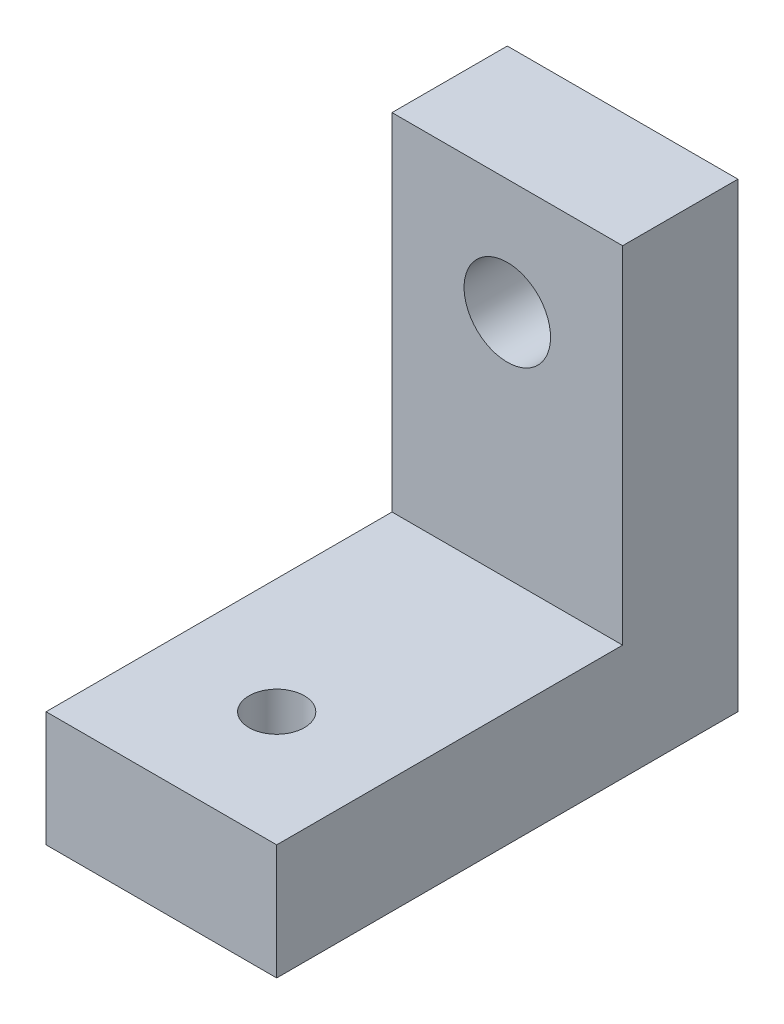
ISO-10303-21;
HEADER;
FILE_DESCRIPTION(('STEP AP214'),'2;1');
FILE_NAME('part.step','',(''),(''),'','','');
FILE_SCHEMA(('AUTOMOTIVE_DESIGN { 1 0 10303 214 1 1 1 1 }'));
ENDSEC;
DATA;
#1=APPLICATION_CONTEXT('core data for automotive mechanical design processes');
#2=APPLICATION_PROTOCOL_DEFINITION('international standard','automotive_design',2000,#1);
#3=PRODUCT_CONTEXT('',#1,'mechanical');
#4=PRODUCT('Part','Part','',(#3));
#5=PRODUCT_RELATED_PRODUCT_CATEGORY('part','',(#4));
#6=PRODUCT_DEFINITION_FORMATION('','',#4);
#7=PRODUCT_DEFINITION_CONTEXT('part definition',#1,'design');
#8=PRODUCT_DEFINITION('design','',#6,#7);
#9=PRODUCT_DEFINITION_SHAPE('','',#8);
#10=(LENGTH_UNIT() NAMED_UNIT(*) SI_UNIT(.MILLI.,.METRE.));
#11=(NAMED_UNIT(*) PLANE_ANGLE_UNIT() SI_UNIT($,.RADIAN.));
#12=(NAMED_UNIT(*) SI_UNIT($,.STERADIAN.) SOLID_ANGLE_UNIT());
#13=UNCERTAINTY_MEASURE_WITH_UNIT(LENGTH_MEASURE(1.E-05),#10,'distance_accuracy_value','');
#14=(GEOMETRIC_REPRESENTATION_CONTEXT(3) GLOBAL_UNCERTAINTY_ASSIGNED_CONTEXT((#13)) GLOBAL_UNIT_ASSIGNED_CONTEXT((#10,
#11,#12)) REPRESENTATION_CONTEXT('',''));
#15=CARTESIAN_POINT('',(0.,0.,0.));
#16=DIRECTION('',(0.,0.,1.));
#17=DIRECTION('',(1.,0.,0.));
#18=AXIS2_PLACEMENT_3D('',#15,#16,#17);
#19=CARTESIAN_POINT('',(0.,0.,6.35));
#20=DIRECTION('',(0.,0.,-1.));
#21=DIRECTION('',(-1.,0.,0.));
#22=AXIS2_PLACEMENT_3D('',#19,#20,#21);
#23=PLANE('',#22);
#24=CARTESIAN_POINT('',(0.,0.,6.35));
#25=DIRECTION('',(0.,0.,1.));
#26=DIRECTION('',(1.,0.,0.));
#27=AXIS2_PLACEMENT_3D('',#24,#25,#26);
#28=CIRCLE('',#27,2.38125);
#29=CARTESIAN_POINT('',(2.38125,0.,6.35));
#30=VERTEX_POINT('',#29);
#31=EDGE_CURVE('E127',#30,#30,#28,.T.);
#32=ORIENTED_EDGE('',*,*,#31,.F.);
#33=EDGE_LOOP('',(#32));
#34=FACE_BOUND('',#33,.T.);
#35=DIRECTION('',(-1.,0.,0.));
#36=VECTOR('',#35,1.);
#37=CARTESIAN_POINT('',(-6.35,-12.7,6.35));
#38=LINE('',#37,#36);
#39=CARTESIAN_POINT('',(6.35,-12.7,6.35));
#40=VERTEX_POINT('',#39);
#41=CARTESIAN_POINT('',(-6.35,-12.7,6.35));
#42=VERTEX_POINT('',#41);
#43=EDGE_CURVE('E55',#40,#42,#38,.T.);
#44=ORIENTED_EDGE('',*,*,#43,.F.);
#45=DIRECTION('',(0.,1.,0.));
#46=VECTOR('',#45,1.);
#47=CARTESIAN_POINT('',(6.35,0.,6.35));
#48=LINE('',#47,#46);
#49=CARTESIAN_POINT('',(6.35,6.35,6.35));
#50=VERTEX_POINT('',#49);
#51=EDGE_CURVE('E112',#40,#50,#48,.T.);
#52=ORIENTED_EDGE('',*,*,#51,.T.);
#53=DIRECTION('',(-1.,0.,0.));
#54=VECTOR('',#53,1.);
#55=CARTESIAN_POINT('',(-6.35,6.35,6.35));
#56=LINE('',#55,#54);
#57=CARTESIAN_POINT('',(-6.35,6.35,6.35));
#58=VERTEX_POINT('',#57);
#59=EDGE_CURVE('E61',#50,#58,#56,.T.);
#60=ORIENTED_EDGE('',*,*,#59,.T.);
#61=DIRECTION('',(0.,-1.,0.));
#62=VECTOR('',#61,1.);
#63=CARTESIAN_POINT('',(-6.35,0.,6.35));
#64=LINE('',#63,#62);
#65=EDGE_CURVE('E105',#58,#42,#64,.T.);
#66=ORIENTED_EDGE('',*,*,#65,.T.);
#67=EDGE_LOOP('',(#44,#52,#60,#66));
#68=FACE_BOUND('',#67,.T.);
#69=ADVANCED_FACE('F39',(#34,#68),#23,.F.);
#70=CARTESIAN_POINT('',(0.,0.,0.));
#71=DIRECTION('',(0.,0.,-1.));
#72=DIRECTION('',(-1.,0.,0.));
#73=AXIS2_PLACEMENT_3D('',#70,#71,#72);
#74=PLANE('',#73);
#75=DIRECTION('',(-1.,0.,0.));
#76=VECTOR('',#75,1.);
#77=CARTESIAN_POINT('',(-6.35,6.35,0.));
#78=LINE('',#77,#76);
#79=CARTESIAN_POINT('',(6.35,6.35,0.));
#80=VERTEX_POINT('',#79);
#81=CARTESIAN_POINT('',(-6.35,6.35,0.));
#82=VERTEX_POINT('',#81);
#83=EDGE_CURVE('E110',#80,#82,#78,.T.);
#84=ORIENTED_EDGE('',*,*,#83,.F.);
#85=DIRECTION('',(0.,1.,0.));
#86=VECTOR('',#85,1.);
#87=CARTESIAN_POINT('',(6.35,-19.05,0.));
#88=LINE('',#87,#86);
#89=CARTESIAN_POINT('',(6.35,-19.05,0.));
#90=VERTEX_POINT('',#89);
#91=EDGE_CURVE('E93',#90,#80,#88,.T.);
#92=ORIENTED_EDGE('',*,*,#91,.F.);
#93=DIRECTION('',(1.,0.,0.));
#94=VECTOR('',#93,1.);
#95=CARTESIAN_POINT('',(-6.35,-19.05,0.));
#96=LINE('',#95,#94);
#97=CARTESIAN_POINT('',(-6.35,-19.05,0.));
#98=VERTEX_POINT('',#97);
#99=EDGE_CURVE('E81',#98,#90,#96,.T.);
#100=ORIENTED_EDGE('',*,*,#99,.F.);
#101=DIRECTION('',(0.,-1.,0.));
#102=VECTOR('',#101,1.);
#103=CARTESIAN_POINT('',(-6.35,0.,0.));
#104=LINE('',#103,#102);
#105=EDGE_CURVE('E94',#82,#98,#104,.T.);
#106=ORIENTED_EDGE('',*,*,#105,.F.);
#107=EDGE_LOOP('',(#84,#92,#100,#106));
#108=FACE_BOUND('',#107,.T.);
#109=CARTESIAN_POINT('',(0.,0.,0.));
#110=DIRECTION('',(0.,0.,1.));
#111=DIRECTION('',(1.,0.,0.));
#112=AXIS2_PLACEMENT_3D('',#109,#110,#111);
#113=CIRCLE('',#112,2.38125);
#114=CARTESIAN_POINT('',(2.38125,0.,0.));
#115=VERTEX_POINT('',#114);
#116=EDGE_CURVE('E132',#115,#115,#113,.T.);
#117=ORIENTED_EDGE('',*,*,#116,.T.);
#118=EDGE_LOOP('',(#117));
#119=FACE_BOUND('',#118,.T.);
#120=ADVANCED_FACE('F107',(#108,#119),#74,.T.);
#121=CARTESIAN_POINT('',(-6.35,6.35,6.35));
#122=DIRECTION('',(0.,-1.,0.));
#123=DIRECTION('',(0.,0.,-1.));
#124=AXIS2_PLACEMENT_3D('',#121,#122,#123);
#125=PLANE('',#124);
#126=ORIENTED_EDGE('',*,*,#83,.T.);
#127=DIRECTION('',(0.,0.,-1.));
#128=VECTOR('',#127,1.);
#129=CARTESIAN_POINT('',(-6.35,6.35,6.35));
#130=LINE('',#129,#128);
#131=EDGE_CURVE('E48',#58,#82,#130,.T.);
#132=ORIENTED_EDGE('',*,*,#131,.F.);
#133=ORIENTED_EDGE('',*,*,#59,.F.);
#134=DIRECTION('',(0.,0.,-1.));
#135=VECTOR('',#134,1.);
#136=CARTESIAN_POINT('',(6.35,6.35,6.35));
#137=LINE('',#136,#135);
#138=EDGE_CURVE('E11',#50,#80,#137,.T.);
#139=ORIENTED_EDGE('',*,*,#138,.T.);
#140=EDGE_LOOP('',(#126,#132,#133,#139));
#141=FACE_BOUND('',#140,.T.);
#142=ADVANCED_FACE('F41',(#141),#125,.F.);
#143=CARTESIAN_POINT('',(-6.35,0.,6.35));
#144=DIRECTION('',(1.,0.,0.));
#145=DIRECTION('',(0.,1.,0.));
#146=AXIS2_PLACEMENT_3D('',#143,#144,#145);
#147=PLANE('',#146);
#148=ORIENTED_EDGE('',*,*,#105,.T.);
#149=DIRECTION('',(0.,0.,-1.));
#150=VECTOR('',#149,1.);
#151=CARTESIAN_POINT('',(-6.35,-19.05,6.35));
#152=LINE('',#151,#150);
#153=CARTESIAN_POINT('',(-6.35,-19.05,25.4));
#154=VERTEX_POINT('',#153);
#155=EDGE_CURVE('E89',#154,#98,#152,.T.);
#156=ORIENTED_EDGE('',*,*,#155,.F.);
#157=DIRECTION('',(0.,-1.,0.));
#158=VECTOR('',#157,1.);
#159=CARTESIAN_POINT('',(-6.35,-19.05,25.4));
#160=LINE('',#159,#158);
#161=CARTESIAN_POINT('',(-6.35,-12.7,25.4));
#162=VERTEX_POINT('',#161);
#163=EDGE_CURVE('E152',#162,#154,#160,.T.);
#164=ORIENTED_EDGE('',*,*,#163,.F.);
#165=DIRECTION('',(0.,0.,-1.));
#166=VECTOR('',#165,1.);
#167=CARTESIAN_POINT('',(-6.35,-12.7,25.4));
#168=LINE('',#167,#166);
#169=EDGE_CURVE('E146',#162,#42,#168,.T.);
#170=ORIENTED_EDGE('',*,*,#169,.T.);
#171=ORIENTED_EDGE('',*,*,#65,.F.);
#172=ORIENTED_EDGE('',*,*,#131,.T.);
#173=EDGE_LOOP('',(#148,#156,#164,#170,#171,#172));
#174=FACE_BOUND('',#173,.T.);
#175=ADVANCED_FACE('F123',(#174),#147,.F.);
#176=CARTESIAN_POINT('',(-6.35,-19.05,6.35));
#177=DIRECTION('',(0.,1.,0.));
#178=DIRECTION('',(0.,0.,1.));
#179=AXIS2_PLACEMENT_3D('',#176,#177,#178);
#180=PLANE('',#179);
#181=CARTESIAN_POINT('',(0.,-19.05,19.05));
#182=DIRECTION('',(0.,1.,0.));
#183=DIRECTION('',(0.,0.,1.));
#184=AXIS2_PLACEMENT_3D('',#181,#182,#183);
#185=CIRCLE('',#184,1.524);
#186=CARTESIAN_POINT('',(0.,-19.05,20.574));
#187=VERTEX_POINT('',#186);
#188=EDGE_CURVE('E153',#187,#187,#185,.T.);
#189=ORIENTED_EDGE('',*,*,#188,.T.);
#190=EDGE_LOOP('',(#189));
#191=FACE_BOUND('',#190,.T.);
#192=ORIENTED_EDGE('',*,*,#99,.T.);
#193=DIRECTION('',(0.,0.,-1.));
#194=VECTOR('',#193,1.);
#195=CARTESIAN_POINT('',(6.35,-19.05,6.35));
#196=LINE('',#195,#194);
#197=CARTESIAN_POINT('',(6.35,-19.05,25.4));
#198=VERTEX_POINT('',#197);
#199=EDGE_CURVE('E86',#198,#90,#196,.T.);
#200=ORIENTED_EDGE('',*,*,#199,.F.);
#201=DIRECTION('',(1.,0.,0.));
#202=VECTOR('',#201,1.);
#203=CARTESIAN_POINT('',(-6.35,-19.05,25.4));
#204=LINE('',#203,#202);
#205=EDGE_CURVE('E159',#154,#198,#204,.T.);
#206=ORIENTED_EDGE('',*,*,#205,.F.);
#207=ORIENTED_EDGE('',*,*,#155,.T.);
#208=EDGE_LOOP('',(#192,#200,#206,#207));
#209=FACE_BOUND('',#208,.T.);
#210=ADVANCED_FACE('F83',(#191,#209),#180,.F.);
#211=CARTESIAN_POINT('',(6.35,-19.05,6.35));
#212=DIRECTION('',(-1.,0.,0.));
#213=DIRECTION('',(0.,-1.,0.));
#214=AXIS2_PLACEMENT_3D('',#211,#212,#213);
#215=PLANE('',#214);
#216=ORIENTED_EDGE('',*,*,#91,.T.);
#217=ORIENTED_EDGE('',*,*,#138,.F.);
#218=ORIENTED_EDGE('',*,*,#51,.F.);
#219=DIRECTION('',(0.,0.,-1.));
#220=VECTOR('',#219,1.);
#221=CARTESIAN_POINT('',(6.35,-12.7,25.4));
#222=LINE('',#221,#220);
#223=CARTESIAN_POINT('',(6.35,-12.7,25.4));
#224=VERTEX_POINT('',#223);
#225=EDGE_CURVE('E141',#224,#40,#222,.T.);
#226=ORIENTED_EDGE('',*,*,#225,.F.);
#227=DIRECTION('',(0.,1.,0.));
#228=VECTOR('',#227,1.);
#229=CARTESIAN_POINT('',(6.35,-19.05,25.4));
#230=LINE('',#229,#228);
#231=EDGE_CURVE('E103',#198,#224,#230,.T.);
#232=ORIENTED_EDGE('',*,*,#231,.F.);
#233=ORIENTED_EDGE('',*,*,#199,.T.);
#234=EDGE_LOOP('',(#216,#217,#218,#226,#232,#233));
#235=FACE_BOUND('',#234,.T.);
#236=ADVANCED_FACE('F98',(#235),#215,.F.);
#237=CARTESIAN_POINT('',(0.,0.,6.35));
#238=DIRECTION('',(0.,0.,-1.));
#239=DIRECTION('',(-1.,0.,0.));
#240=AXIS2_PLACEMENT_3D('',#237,#238,#239);
#241=CYLINDRICAL_SURFACE('',#240,2.38125);
#242=ORIENTED_EDGE('',*,*,#31,.T.);
#243=EDGE_LOOP('',(#242));
#244=FACE_BOUND('',#243,.T.);
#245=ORIENTED_EDGE('',*,*,#116,.F.);
#246=EDGE_LOOP('',(#245));
#247=FACE_BOUND('',#246,.T.);
#248=ADVANCED_FACE('F180',(#244,#247),#241,.F.);
#249=CARTESIAN_POINT('',(-6.35,-12.7,25.4));
#250=DIRECTION('',(0.,-1.,0.));
#251=DIRECTION('',(0.,0.,-1.));
#252=AXIS2_PLACEMENT_3D('',#249,#250,#251);
#253=PLANE('',#252);
#254=CARTESIAN_POINT('',(0.,-12.7,19.05));
#255=DIRECTION('',(0.,1.,0.));
#256=DIRECTION('',(0.,0.,1.));
#257=AXIS2_PLACEMENT_3D('',#254,#255,#256);
#258=CIRCLE('',#257,1.524);
#259=CARTESIAN_POINT('',(0.,-12.7,20.574));
#260=VERTEX_POINT('',#259);
#261=EDGE_CURVE('E168',#260,#260,#258,.T.);
#262=ORIENTED_EDGE('',*,*,#261,.F.);
#263=EDGE_LOOP('',(#262));
#264=FACE_BOUND('',#263,.T.);
#265=ORIENTED_EDGE('',*,*,#43,.T.);
#266=ORIENTED_EDGE('',*,*,#169,.F.);
#267=DIRECTION('',(-1.,0.,0.));
#268=VECTOR('',#267,1.);
#269=CARTESIAN_POINT('',(-6.35,-12.7,25.4));
#270=LINE('',#269,#268);
#271=EDGE_CURVE('E149',#224,#162,#270,.T.);
#272=ORIENTED_EDGE('',*,*,#271,.F.);
#273=ORIENTED_EDGE('',*,*,#225,.T.);
#274=EDGE_LOOP('',(#265,#266,#272,#273));
#275=FACE_BOUND('',#274,.T.);
#276=ADVANCED_FACE('F176',(#264,#275),#253,.F.);
#277=CARTESIAN_POINT('',(0.,0.,25.4));
#278=DIRECTION('',(0.,0.,-1.));
#279=DIRECTION('',(-1.,0.,0.));
#280=AXIS2_PLACEMENT_3D('',#277,#278,#279);
#281=PLANE('',#280);
#282=ORIENTED_EDGE('',*,*,#163,.T.);
#283=ORIENTED_EDGE('',*,*,#205,.T.);
#284=ORIENTED_EDGE('',*,*,#231,.T.);
#285=ORIENTED_EDGE('',*,*,#271,.T.);
#286=EDGE_LOOP('',(#282,#283,#284,#285));
#287=FACE_BOUND('',#286,.T.);
#288=ADVANCED_FACE('F179',(#287),#281,.F.);
#289=CARTESIAN_POINT('',(0.,-31.75,19.05));
#290=DIRECTION('',(0.,1.,0.));
#291=DIRECTION('',(0.,0.,1.));
#292=AXIS2_PLACEMENT_3D('',#289,#290,#291);
#293=CYLINDRICAL_SURFACE('',#292,1.524);
#294=CARTESIAN_POINT('',(0.,-12.7,20.574));
#295=CARTESIAN_POINT('',(0.,-12.7661458333333,20.574));
#296=CARTESIAN_POINT('',(0.,-12.8322916666667,20.574));
#297=CARTESIAN_POINT('',(0.,-12.9645833333333,20.574));
#298=CARTESIAN_POINT('',(0.,-13.0307291666667,20.574));
#299=CARTESIAN_POINT('',(0.,-13.1630208333333,20.574));
#300=CARTESIAN_POINT('',(0.,-13.2291666666667,20.574));
#301=CARTESIAN_POINT('',(0.,-13.3614583333333,20.574));
#302=CARTESIAN_POINT('',(0.,-13.4276041666667,20.574));
#303=CARTESIAN_POINT('',(0.,-13.5598958333333,20.574));
#304=CARTESIAN_POINT('',(0.,-13.6260416666667,20.574));
#305=CARTESIAN_POINT('',(0.,-13.7583333333333,20.574));
#306=CARTESIAN_POINT('',(0.,-13.8244791666667,20.574));
#307=CARTESIAN_POINT('',(0.,-13.9567708333333,20.574));
#308=CARTESIAN_POINT('',(0.,-14.0229166666667,20.574));
#309=CARTESIAN_POINT('',(0.,-14.1552083333333,20.574));
#310=CARTESIAN_POINT('',(0.,-14.2213541666667,20.574));
#311=CARTESIAN_POINT('',(0.,-14.3536458333333,20.574));
#312=CARTESIAN_POINT('',(0.,-14.4197916666667,20.574));
#313=CARTESIAN_POINT('',(0.,-14.5520833333333,20.574));
#314=CARTESIAN_POINT('',(0.,-14.6182291666667,20.574));
#315=CARTESIAN_POINT('',(0.,-14.7505208333333,20.574));
#316=CARTESIAN_POINT('',(0.,-14.8166666666667,20.574));
#317=CARTESIAN_POINT('',(0.,-14.9489583333333,20.574));
#318=CARTESIAN_POINT('',(0.,-15.0151041666667,20.574));
#319=CARTESIAN_POINT('',(0.,-15.1473958333333,20.574));
#320=CARTESIAN_POINT('',(0.,-15.2135416666667,20.574));
#321=CARTESIAN_POINT('',(0.,-15.3458333333333,20.574));
#322=CARTESIAN_POINT('',(0.,-15.4119791666667,20.574));
#323=CARTESIAN_POINT('',(0.,-15.5442708333333,20.574));
#324=CARTESIAN_POINT('',(0.,-15.6104166666667,20.574));
#325=CARTESIAN_POINT('',(0.,-15.7427083333333,20.574));
#326=CARTESIAN_POINT('',(0.,-15.8088541666667,20.574));
#327=CARTESIAN_POINT('',(0.,-15.9411458333333,20.574));
#328=CARTESIAN_POINT('',(0.,-16.0072916666667,20.574));
#329=CARTESIAN_POINT('',(0.,-16.1395833333333,20.574));
#330=CARTESIAN_POINT('',(0.,-16.2057291666667,20.574));
#331=CARTESIAN_POINT('',(0.,-16.3380208333333,20.574));
#332=CARTESIAN_POINT('',(0.,-16.4041666666667,20.574));
#333=CARTESIAN_POINT('',(0.,-16.5364583333333,20.574));
#334=CARTESIAN_POINT('',(0.,-16.6026041666667,20.574));
#335=CARTESIAN_POINT('',(0.,-16.7348958333333,20.574));
#336=CARTESIAN_POINT('',(0.,-16.8010416666667,20.574));
#337=CARTESIAN_POINT('',(0.,-16.9333333333333,20.574));
#338=CARTESIAN_POINT('',(0.,-16.9994791666667,20.574));
#339=CARTESIAN_POINT('',(0.,-17.1317708333333,20.574));
#340=CARTESIAN_POINT('',(0.,-17.1979166666667,20.574));
#341=CARTESIAN_POINT('',(0.,-17.3302083333333,20.574));
#342=CARTESIAN_POINT('',(0.,-17.3963541666667,20.574));
#343=CARTESIAN_POINT('',(0.,-17.5286458333333,20.574));
#344=CARTESIAN_POINT('',(0.,-17.5947916666667,20.574));
#345=CARTESIAN_POINT('',(0.,-17.7270833333333,20.574));
#346=CARTESIAN_POINT('',(0.,-17.7932291666667,20.574));
#347=CARTESIAN_POINT('',(0.,-17.9255208333333,20.574));
#348=CARTESIAN_POINT('',(0.,-17.9916666666667,20.574));
#349=CARTESIAN_POINT('',(0.,-18.1239583333333,20.574));
#350=CARTESIAN_POINT('',(0.,-18.1901041666667,20.574));
#351=CARTESIAN_POINT('',(0.,-18.3223958333333,20.574));
#352=CARTESIAN_POINT('',(0.,-18.3885416666667,20.574));
#353=CARTESIAN_POINT('',(0.,-18.5208333333333,20.574));
#354=CARTESIAN_POINT('',(0.,-18.5869791666667,20.574));
#355=CARTESIAN_POINT('',(0.,-18.7192708333333,20.574));
#356=CARTESIAN_POINT('',(0.,-18.7854166666667,20.574));
#357=CARTESIAN_POINT('',(0.,-18.9177083333333,20.574));
#358=CARTESIAN_POINT('',(0.,-18.9838541666667,20.574));
#359=CARTESIAN_POINT('',(0.,-19.05,20.574));
#360=B_SPLINE_CURVE_WITH_KNOTS('',3,(#294,#295,#296,#297,#298,#299,#300,#301,#302,#303,#304,
#305,#306,#307,#308,#309,#310,#311,#312,#313,#314,#315,#316,#317,#318,#319,#320,#321,#322,#323,
#324,#325,#326,#327,#328,#329,#330,#331,#332,#333,#334,#335,#336,#337,#338,#339,#340,#341,#342,
#343,#344,#345,#346,#347,#348,#349,#350,#351,#352,#353,#354,#355,#356,#357,#358,#359),
.UNSPECIFIED.,.F.,.F.,(4,2,2,2,2,2,2,2,2,2,2,2,2,2,2,2,2,2,2,2,2,2,2,2,2,2,2,2,2,2,2,2,4),(0.,
0.198437499999999,0.396875000000001,0.5953125,0.793749999999999,0.992187500000002,1.190625,
1.3890625,1.5875,1.7859375,1.984375,2.1828125,2.38125,2.5796875,2.778125,2.9765625,3.175,
3.3734375,3.571875,3.7703125,3.96875,4.1671875,4.365625,4.5640625,4.7625,4.9609375,5.159375,
5.3578125,5.55625,5.7546875,5.953125,6.1515625,6.35),.UNSPECIFIED.);
#361=EDGE_CURVE('BSEAM173',#260,#187,#360,.T.);
#362=ORIENTED_EDGE('',*,*,#261,.T.);
#363=ORIENTED_EDGE('',*,*,#188,.F.);
#364=ORIENTED_EDGE('',*,*,#361,.T.);
#365=ORIENTED_EDGE('',*,*,#361,.F.);
#366=EDGE_LOOP('',(#362,#364,#363,#365));
#367=FACE_BOUND('',#366,.T.);
#368=ADVANCED_FACE('F173',(#367),#293,.F.);
#369=CLOSED_SHELL('',(#69,#120,#142,#175,#210,#236,#248,#276,#288,#368));
#370=MANIFOLD_SOLID_BREP('B2',#369);
#371=ADVANCED_BREP_SHAPE_REPRESENTATION('',(#18,#370),#14);
#372=SHAPE_DEFINITION_REPRESENTATION(#9,#371);
ENDSEC;
END-ISO-10303-21;
